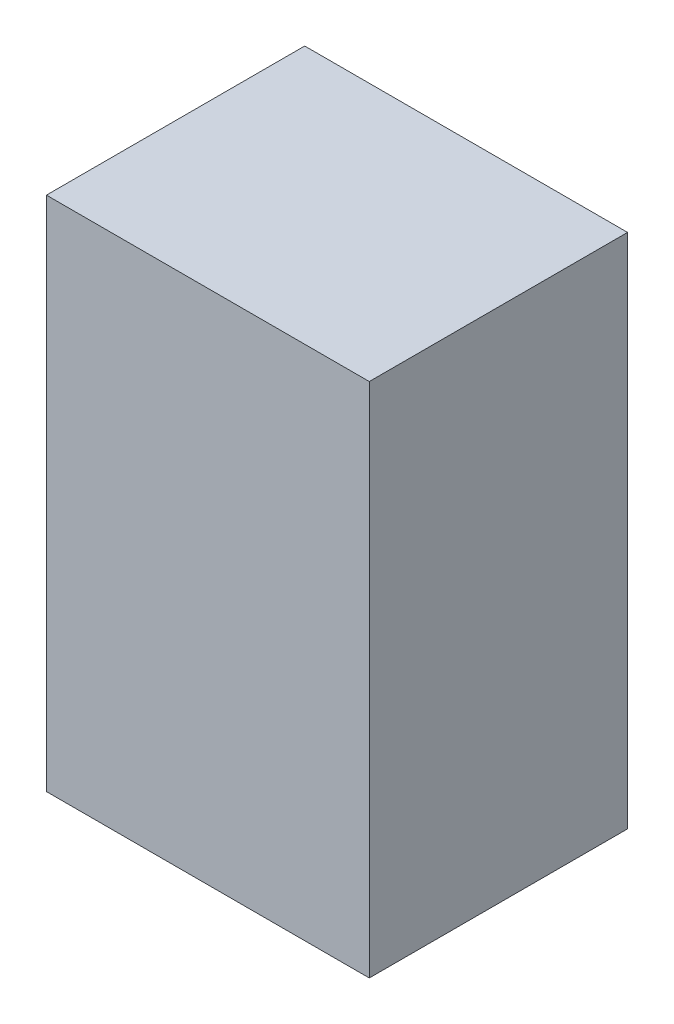
ISO-10303-21;
HEADER;
FILE_DESCRIPTION(('STEP AP214'),'2;1');
FILE_NAME('part.step','',(''),(''),'','','');
FILE_SCHEMA(('AUTOMOTIVE_DESIGN { 1 0 10303 214 1 1 1 1 }'));
ENDSEC;
DATA;
#1=APPLICATION_CONTEXT('core data for automotive mechanical design processes');
#2=APPLICATION_PROTOCOL_DEFINITION('international standard','automotive_design',2000,#1);
#3=PRODUCT_CONTEXT('',#1,'mechanical');
#4=PRODUCT('Part','Part','',(#3));
#5=PRODUCT_RELATED_PRODUCT_CATEGORY('part','',(#4));
#6=PRODUCT_DEFINITION_FORMATION('','',#4);
#7=PRODUCT_DEFINITION_CONTEXT('part definition',#1,'design');
#8=PRODUCT_DEFINITION('design','',#6,#7);
#9=PRODUCT_DEFINITION_SHAPE('','',#8);
#10=(LENGTH_UNIT() NAMED_UNIT(*) SI_UNIT(.MILLI.,.METRE.));
#11=(NAMED_UNIT(*) PLANE_ANGLE_UNIT() SI_UNIT($,.RADIAN.));
#12=(NAMED_UNIT(*) SI_UNIT($,.STERADIAN.) SOLID_ANGLE_UNIT());
#13=UNCERTAINTY_MEASURE_WITH_UNIT(LENGTH_MEASURE(1.E-05),#10,'distance_accuracy_value','');
#14=(GEOMETRIC_REPRESENTATION_CONTEXT(3) GLOBAL_UNCERTAINTY_ASSIGNED_CONTEXT((#13)) GLOBAL_UNIT_ASSIGNED_CONTEXT((#10,
#11,#12)) REPRESENTATION_CONTEXT('',''));
#15=CARTESIAN_POINT('',(0.,0.,0.));
#16=DIRECTION('',(0.,0.,1.));
#17=DIRECTION('',(1.,0.,0.));
#18=AXIS2_PLACEMENT_3D('',#15,#16,#17);
#19=CARTESIAN_POINT('',(0.,0.,0.2));
#20=DIRECTION('',(0.,1.,0.));
#21=DIRECTION('',(0.,0.,1.));
#22=AXIS2_PLACEMENT_3D('',#19,#20,#21);
#23=PLANE('',#22);
#24=DIRECTION('',(1.,0.,0.));
#25=VECTOR('',#24,1.);
#26=CARTESIAN_POINT('',(0.,0.,0.));
#27=LINE('',#26,#25);
#28=CARTESIAN_POINT('',(0.,0.,0.));
#29=VERTEX_POINT('',#28);
#30=CARTESIAN_POINT('',(0.25,0.,0.));
#31=VERTEX_POINT('',#30);
#32=EDGE_CURVE('E98',#29,#31,#27,.T.);
#33=ORIENTED_EDGE('',*,*,#32,.T.);
#34=DIRECTION('',(0.,0.,-1.));
#35=VECTOR('',#34,1.);
#36=CARTESIAN_POINT('',(0.25,0.,0.2));
#37=LINE('',#36,#35);
#38=CARTESIAN_POINT('',(0.25,0.,0.2));
#39=VERTEX_POINT('',#38);
#40=EDGE_CURVE('E11',#39,#31,#37,.T.);
#41=ORIENTED_EDGE('',*,*,#40,.F.);
#42=DIRECTION('',(1.,0.,0.));
#43=VECTOR('',#42,1.);
#44=CARTESIAN_POINT('',(0.,0.,0.2));
#45=LINE('',#44,#43);
#46=CARTESIAN_POINT('',(0.,0.,0.2));
#47=VERTEX_POINT('',#46);
#48=EDGE_CURVE('E84',#47,#39,#45,.T.);
#49=ORIENTED_EDGE('',*,*,#48,.F.);
#50=DIRECTION('',(0.,0.,-1.));
#51=VECTOR('',#50,1.);
#52=CARTESIAN_POINT('',(0.,0.,0.2));
#53=LINE('',#52,#51);
#54=EDGE_CURVE('E51',#47,#29,#53,.T.);
#55=ORIENTED_EDGE('',*,*,#54,.T.);
#56=EDGE_LOOP('',(#33,#41,#49,#55));
#57=FACE_BOUND('',#56,.T.);
#58=ADVANCED_FACE('F35',(#57),#23,.F.);
#59=CARTESIAN_POINT('',(0.25,0.,0.2));
#60=DIRECTION('',(-1.,0.,0.));
#61=DIRECTION('',(0.,0.,1.));
#62=AXIS2_PLACEMENT_3D('',#59,#60,#61);
#63=PLANE('',#62);
#64=DIRECTION('',(0.,1.,0.));
#65=VECTOR('',#64,1.);
#66=CARTESIAN_POINT('',(0.25,0.,0.));
#67=LINE('',#66,#65);
#68=CARTESIAN_POINT('',(0.25,0.4,0.));
#69=VERTEX_POINT('',#68);
#70=EDGE_CURVE('E89',#31,#69,#67,.T.);
#71=ORIENTED_EDGE('',*,*,#70,.T.);
#72=DIRECTION('',(0.,0.,-1.));
#73=VECTOR('',#72,1.);
#74=CARTESIAN_POINT('',(0.25,0.4,0.2));
#75=LINE('',#74,#73);
#76=CARTESIAN_POINT('',(0.25,0.4,0.2));
#77=VERTEX_POINT('',#76);
#78=EDGE_CURVE('E43',#77,#69,#75,.T.);
#79=ORIENTED_EDGE('',*,*,#78,.F.);
#80=DIRECTION('',(0.,1.,0.));
#81=VECTOR('',#80,1.);
#82=CARTESIAN_POINT('',(0.25,0.,0.2));
#83=LINE('',#82,#81);
#84=EDGE_CURVE('E76',#39,#77,#83,.T.);
#85=ORIENTED_EDGE('',*,*,#84,.F.);
#86=ORIENTED_EDGE('',*,*,#40,.T.);
#87=EDGE_LOOP('',(#71,#79,#85,#86));
#88=FACE_BOUND('',#87,.T.);
#89=ADVANCED_FACE('F88',(#88),#63,.F.);
#90=CARTESIAN_POINT('',(0.,0.4,0.2));
#91=DIRECTION('',(0.,1.,0.));
#92=DIRECTION('',(0.,0.,1.));
#93=AXIS2_PLACEMENT_3D('',#90,#91,#92);
#94=PLANE('',#93);
#95=DIRECTION('',(1.,0.,0.));
#96=VECTOR('',#95,1.);
#97=CARTESIAN_POINT('',(0.,0.4,0.));
#98=LINE('',#97,#96);
#99=CARTESIAN_POINT('',(0.,0.4,0.));
#100=VERTEX_POINT('',#99);
#101=EDGE_CURVE('E101',#100,#69,#98,.T.);
#102=ORIENTED_EDGE('',*,*,#101,.F.);
#103=DIRECTION('',(0.,0.,-1.));
#104=VECTOR('',#103,1.);
#105=CARTESIAN_POINT('',(0.,0.4,0.2));
#106=LINE('',#105,#104);
#107=CARTESIAN_POINT('',(0.,0.4,0.2));
#108=VERTEX_POINT('',#107);
#109=EDGE_CURVE('E65',#108,#100,#106,.T.);
#110=ORIENTED_EDGE('',*,*,#109,.F.);
#111=DIRECTION('',(1.,0.,0.));
#112=VECTOR('',#111,1.);
#113=CARTESIAN_POINT('',(0.,0.4,0.2));
#114=LINE('',#113,#112);
#115=EDGE_CURVE('E83',#108,#77,#114,.T.);
#116=ORIENTED_EDGE('',*,*,#115,.T.);
#117=ORIENTED_EDGE('',*,*,#78,.T.);
#118=EDGE_LOOP('',(#102,#110,#116,#117));
#119=FACE_BOUND('',#118,.T.);
#120=ADVANCED_FACE('F92',(#119),#94,.T.);
#121=CARTESIAN_POINT('',(0.,0.,0.2));
#122=DIRECTION('',(-1.,0.,0.));
#123=DIRECTION('',(0.,0.,1.));
#124=AXIS2_PLACEMENT_3D('',#121,#122,#123);
#125=PLANE('',#124);
#126=DIRECTION('',(0.,1.,0.));
#127=VECTOR('',#126,1.);
#128=CARTESIAN_POINT('',(0.,0.,0.));
#129=LINE('',#128,#127);
#130=EDGE_CURVE('E103',#29,#100,#129,.T.);
#131=ORIENTED_EDGE('',*,*,#130,.F.);
#132=ORIENTED_EDGE('',*,*,#54,.F.);
#133=DIRECTION('',(0.,1.,0.));
#134=VECTOR('',#133,1.);
#135=CARTESIAN_POINT('',(0.,0.,0.2));
#136=LINE('',#135,#134);
#137=EDGE_CURVE('E93',#47,#108,#136,.T.);
#138=ORIENTED_EDGE('',*,*,#137,.T.);
#139=ORIENTED_EDGE('',*,*,#109,.T.);
#140=EDGE_LOOP('',(#131,#132,#138,#139));
#141=FACE_BOUND('',#140,.T.);
#142=ADVANCED_FACE('F109',(#141),#125,.T.);
#143=CARTESIAN_POINT('',(0.,0.,0.2));
#144=DIRECTION('',(0.,0.,1.));
#145=DIRECTION('',(1.,0.,0.));
#146=AXIS2_PLACEMENT_3D('',#143,#144,#145);
#147=PLANE('',#146);
#148=ORIENTED_EDGE('',*,*,#48,.T.);
#149=ORIENTED_EDGE('',*,*,#84,.T.);
#150=ORIENTED_EDGE('',*,*,#115,.F.);
#151=ORIENTED_EDGE('',*,*,#137,.F.);
#152=EDGE_LOOP('',(#148,#149,#150,#151));
#153=FACE_BOUND('',#152,.T.);
#154=ADVANCED_FACE('F80',(#153),#147,.T.);
#155=CARTESIAN_POINT('',(0.,0.,0.));
#156=DIRECTION('',(0.,0.,1.));
#157=DIRECTION('',(1.,0.,0.));
#158=AXIS2_PLACEMENT_3D('',#155,#156,#157);
#159=PLANE('',#158);
#160=ORIENTED_EDGE('',*,*,#32,.F.);
#161=ORIENTED_EDGE('',*,*,#130,.T.);
#162=ORIENTED_EDGE('',*,*,#101,.T.);
#163=ORIENTED_EDGE('',*,*,#70,.F.);
#164=EDGE_LOOP('',(#160,#161,#162,#163));
#165=FACE_BOUND('',#164,.T.);
#166=ADVANCED_FACE('F108',(#165),#159,.F.);
#167=CLOSED_SHELL('',(#58,#89,#120,#142,#154,#166));
#168=MANIFOLD_SOLID_BREP('B2',#167);
#169=ADVANCED_BREP_SHAPE_REPRESENTATION('',(#18,#168),#14);
#170=SHAPE_DEFINITION_REPRESENTATION(#9,#169);
ENDSEC;
END-ISO-10303-21;
